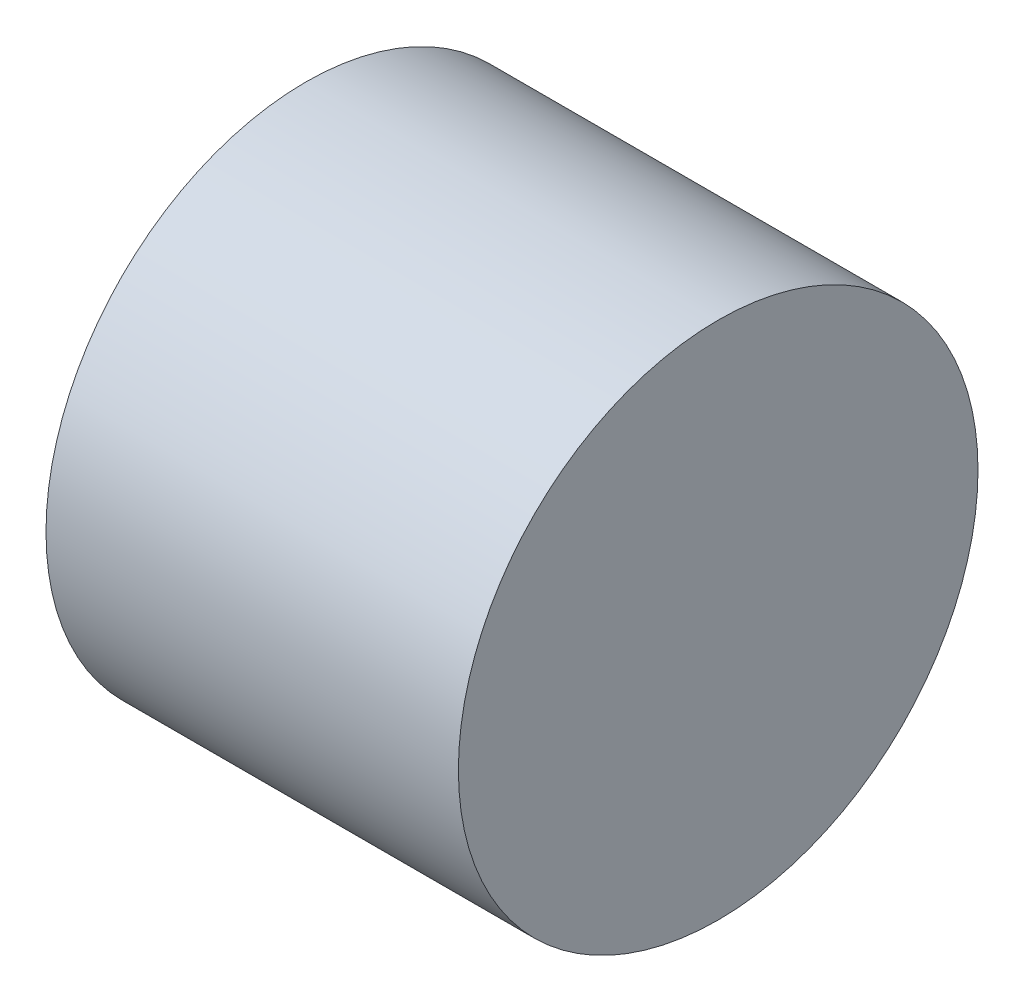
ISO-10303-21;
HEADER;
FILE_DESCRIPTION(('STEP AP214'),'2;1');
FILE_NAME('part.step','',(''),(''),'','','');
FILE_SCHEMA(('AUTOMOTIVE_DESIGN { 1 0 10303 214 1 1 1 1 }'));
ENDSEC;
DATA;
#1=APPLICATION_CONTEXT('core data for automotive mechanical design processes');
#2=APPLICATION_PROTOCOL_DEFINITION('international standard','automotive_design',2000,#1);
#3=PRODUCT_CONTEXT('',#1,'mechanical');
#4=PRODUCT('Part','Part','',(#3));
#5=PRODUCT_RELATED_PRODUCT_CATEGORY('part','',(#4));
#6=PRODUCT_DEFINITION_FORMATION('','',#4);
#7=PRODUCT_DEFINITION_CONTEXT('part definition',#1,'design');
#8=PRODUCT_DEFINITION('design','',#6,#7);
#9=PRODUCT_DEFINITION_SHAPE('','',#8);
#10=(LENGTH_UNIT() NAMED_UNIT(*) SI_UNIT(.MILLI.,.METRE.));
#11=(NAMED_UNIT(*) PLANE_ANGLE_UNIT() SI_UNIT($,.RADIAN.));
#12=(NAMED_UNIT(*) SI_UNIT($,.STERADIAN.) SOLID_ANGLE_UNIT());
#13=UNCERTAINTY_MEASURE_WITH_UNIT(LENGTH_MEASURE(1.E-05),#10,'distance_accuracy_value','');
#14=(GEOMETRIC_REPRESENTATION_CONTEXT(3) GLOBAL_UNCERTAINTY_ASSIGNED_CONTEXT((#13)) GLOBAL_UNIT_ASSIGNED_CONTEXT((#10,
#11,#12)) REPRESENTATION_CONTEXT('',''));
#15=CARTESIAN_POINT('',(0.,0.,0.));
#16=DIRECTION('',(0.,0.,1.));
#17=DIRECTION('',(1.,0.,0.));
#18=AXIS2_PLACEMENT_3D('',#15,#16,#17);
#19=CARTESIAN_POINT('',(25.,0.,0.));
#20=DIRECTION('',(-1.,0.,0.));
#21=DIRECTION('',(0.,0.,1.));
#22=AXIS2_PLACEMENT_3D('',#19,#20,#21);
#23=CYLINDRICAL_SURFACE('',#22,31.5);
#24=CARTESIAN_POINT('',(25.,0.,0.));
#25=DIRECTION('',(1.,0.,0.));
#26=DIRECTION('',(0.,0.,-1.));
#27=AXIS2_PLACEMENT_3D('',#24,#25,#26);
#28=CIRCLE('',#27,31.5);
#29=CARTESIAN_POINT('',(25.,0.,-31.5));
#30=VERTEX_POINT('',#29);
#31=EDGE_CURVE('E10',#30,#30,#28,.T.);
#32=ORIENTED_EDGE('',*,*,#31,.F.);
#33=EDGE_LOOP('',(#32));
#34=FACE_BOUND('',#33,.T.);
#35=CARTESIAN_POINT('',(-25.,0.,0.));
#36=DIRECTION('',(1.,0.,0.));
#37=DIRECTION('',(0.,0.,-1.));
#38=AXIS2_PLACEMENT_3D('',#35,#36,#37);
#39=CIRCLE('',#38,31.5);
#40=CARTESIAN_POINT('',(-25.,0.,-31.5));
#41=VERTEX_POINT('',#40);
#42=EDGE_CURVE('E35',#41,#41,#39,.T.);
#43=ORIENTED_EDGE('',*,*,#42,.T.);
#44=EDGE_LOOP('',(#43));
#45=FACE_BOUND('',#44,.T.);
#46=ADVANCED_FACE('F32',(#34,#45),#23,.T.);
#47=CARTESIAN_POINT('',(25.,0.,0.));
#48=DIRECTION('',(1.,0.,0.));
#49=DIRECTION('',(0.,0.,-1.));
#50=AXIS2_PLACEMENT_3D('',#47,#48,#49);
#51=PLANE('',#50);
#52=ORIENTED_EDGE('',*,*,#31,.T.);
#53=EDGE_LOOP('',(#52));
#54=FACE_BOUND('',#53,.T.);
#55=ADVANCED_FACE('F47',(#54),#51,.T.);
#56=CARTESIAN_POINT('',(-25.,0.,0.));
#57=DIRECTION('',(1.,0.,0.));
#58=DIRECTION('',(0.,0.,-1.));
#59=AXIS2_PLACEMENT_3D('',#56,#57,#58);
#60=PLANE('',#59);
#61=ORIENTED_EDGE('',*,*,#42,.F.);
#62=EDGE_LOOP('',(#61));
#63=FACE_BOUND('',#62,.T.);
#64=ADVANCED_FACE('F45',(#63),#60,.F.);
#65=CLOSED_SHELL('',(#46,#55,#64));
#66=MANIFOLD_SOLID_BREP('B2',#65);
#67=ADVANCED_BREP_SHAPE_REPRESENTATION('',(#18,#66),#14);
#68=SHAPE_DEFINITION_REPRESENTATION(#9,#67);
ENDSEC;
END-ISO-10303-21;
